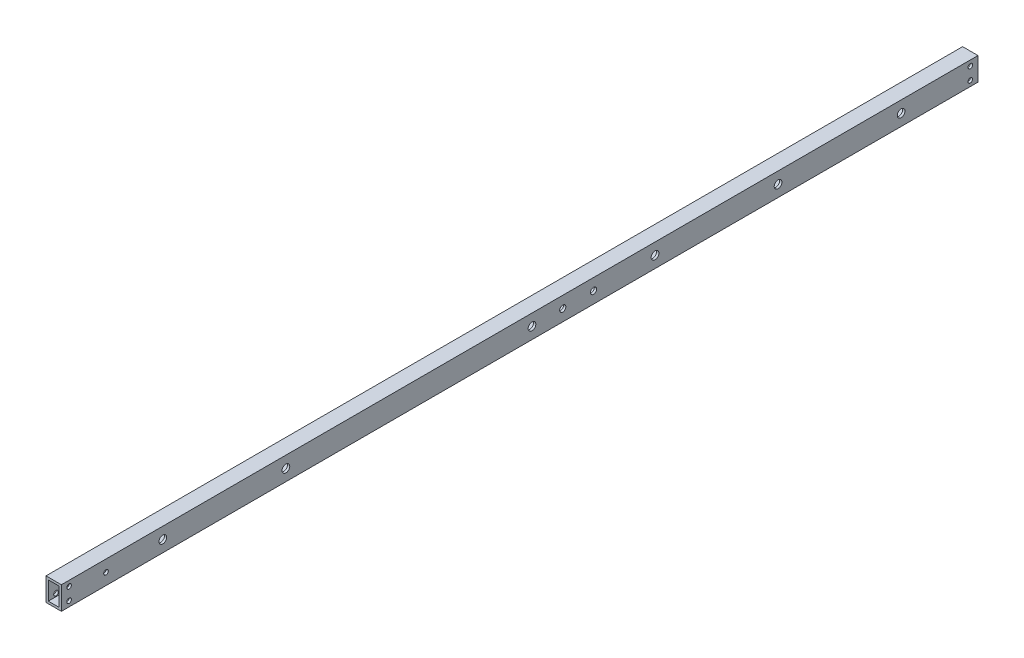
ISO-10303-21;
HEADER;
FILE_DESCRIPTION(('STEP AP214'),'2;1');
FILE_NAME('part.step','',(''),(''),'','','');
FILE_SCHEMA(('AUTOMOTIVE_DESIGN { 1 0 10303 214 1 1 1 1 }'));
ENDSEC;
DATA;
#1=APPLICATION_CONTEXT('core data for automotive mechanical design processes');
#2=APPLICATION_PROTOCOL_DEFINITION('international standard','automotive_design',2000,#1);
#3=PRODUCT_CONTEXT('',#1,'mechanical');
#4=PRODUCT('Part','Part','',(#3));
#5=PRODUCT_RELATED_PRODUCT_CATEGORY('part','',(#4));
#6=PRODUCT_DEFINITION_FORMATION('','',#4);
#7=PRODUCT_DEFINITION_CONTEXT('part definition',#1,'design');
#8=PRODUCT_DEFINITION('design','',#6,#7);
#9=PRODUCT_DEFINITION_SHAPE('','',#8);
#10=(LENGTH_UNIT() NAMED_UNIT(*) SI_UNIT(.MILLI.,.METRE.));
#11=(NAMED_UNIT(*) PLANE_ANGLE_UNIT() SI_UNIT($,.RADIAN.));
#12=(NAMED_UNIT(*) SI_UNIT($,.STERADIAN.) SOLID_ANGLE_UNIT());
#13=UNCERTAINTY_MEASURE_WITH_UNIT(LENGTH_MEASURE(1.E-05),#10,'distance_accuracy_value','');
#14=(GEOMETRIC_REPRESENTATION_CONTEXT(3) GLOBAL_UNCERTAINTY_ASSIGNED_CONTEXT((#13)) GLOBAL_UNIT_ASSIGNED_CONTEXT((#10,
#11,#12)) REPRESENTATION_CONTEXT('',''));
#15=CARTESIAN_POINT('',(0.,0.,0.));
#16=DIRECTION('',(0.,0.,1.));
#17=DIRECTION('',(1.,0.,0.));
#18=AXIS2_PLACEMENT_3D('',#15,#16,#17);
#19=CARTESIAN_POINT('',(0.,0.,596.));
#20=DIRECTION('',(0.,0.,1.));
#21=DIRECTION('',(1.,0.,0.));
#22=AXIS2_PLACEMENT_3D('',#19,#20,#21);
#23=PLANE('',#22);
#24=DIRECTION('',(0.,1.,0.));
#25=VECTOR('',#24,1.);
#26=CARTESIAN_POINT('',(5.,-7.5,596.));
#27=LINE('',#26,#25);
#28=CARTESIAN_POINT('',(5.,-7.5,596.));
#29=VERTEX_POINT('',#28);
#30=CARTESIAN_POINT('',(5.,7.5,596.));
#31=VERTEX_POINT('',#30);
#32=EDGE_CURVE('E181',#29,#31,#27,.T.);
#33=ORIENTED_EDGE('',*,*,#32,.T.);
#34=DIRECTION('',(-1.,0.,0.));
#35=VECTOR('',#34,1.);
#36=CARTESIAN_POINT('',(-5.,7.5,596.));
#37=LINE('',#36,#35);
#38=CARTESIAN_POINT('',(-5.,7.5,596.));
#39=VERTEX_POINT('',#38);
#40=EDGE_CURVE('E185',#31,#39,#37,.T.);
#41=ORIENTED_EDGE('',*,*,#40,.T.);
#42=DIRECTION('',(0.,-1.,0.));
#43=VECTOR('',#42,1.);
#44=CARTESIAN_POINT('',(-5.,-7.5,596.));
#45=LINE('',#44,#43);
#46=CARTESIAN_POINT('',(-5.,-7.5,596.));
#47=VERTEX_POINT('',#46);
#48=EDGE_CURVE('E189',#39,#47,#45,.T.);
#49=ORIENTED_EDGE('',*,*,#48,.T.);
#50=DIRECTION('',(1.,0.,0.));
#51=VECTOR('',#50,1.);
#52=CARTESIAN_POINT('',(-5.,-7.5,596.));
#53=LINE('',#52,#51);
#54=EDGE_CURVE('E192',#47,#29,#53,.T.);
#55=ORIENTED_EDGE('',*,*,#54,.T.);
#56=EDGE_LOOP('',(#33,#41,#49,#55));
#57=FACE_BOUND('',#56,.T.);
#58=DIRECTION('',(-1.,0.,0.));
#59=VECTOR('',#58,1.);
#60=CARTESIAN_POINT('',(0.,6.,596.));
#61=LINE('',#60,#59);
#62=CARTESIAN_POINT('',(3.5,6.,596.));
#63=VERTEX_POINT('',#62);
#64=CARTESIAN_POINT('',(-3.5,6.,596.));
#65=VERTEX_POINT('',#64);
#66=EDGE_CURVE('E140',#63,#65,#61,.T.);
#67=ORIENTED_EDGE('',*,*,#66,.F.);
#68=DIRECTION('',(0.,1.,0.));
#69=VECTOR('',#68,1.);
#70=CARTESIAN_POINT('',(3.5,0.,596.));
#71=LINE('',#70,#69);
#72=CARTESIAN_POINT('',(3.5,-6.,596.));
#73=VERTEX_POINT('',#72);
#74=EDGE_CURVE('E131',#73,#63,#71,.T.);
#75=ORIENTED_EDGE('',*,*,#74,.F.);
#76=DIRECTION('',(1.,0.,0.));
#77=VECTOR('',#76,1.);
#78=CARTESIAN_POINT('',(0.,-6.,596.));
#79=LINE('',#78,#77);
#80=CARTESIAN_POINT('',(-3.5,-6.,596.));
#81=VERTEX_POINT('',#80);
#82=EDGE_CURVE('E157',#81,#73,#79,.T.);
#83=ORIENTED_EDGE('',*,*,#82,.F.);
#84=DIRECTION('',(0.,-1.,0.));
#85=VECTOR('',#84,1.);
#86=CARTESIAN_POINT('',(-3.5,0.,596.));
#87=LINE('',#86,#85);
#88=EDGE_CURVE('E153',#65,#81,#87,.T.);
#89=ORIENTED_EDGE('',*,*,#88,.F.);
#90=EDGE_LOOP('',(#67,#75,#83,#89));
#91=FACE_BOUND('',#90,.T.);
#92=ADVANCED_FACE('F63',(#57,#91),#23,.T.);
#93=CARTESIAN_POINT('',(0.,0.,0.));
#94=DIRECTION('',(0.,0.,1.));
#95=DIRECTION('',(1.,0.,0.));
#96=AXIS2_PLACEMENT_3D('',#93,#94,#95);
#97=PLANE('',#96);
#98=DIRECTION('',(0.,1.,0.));
#99=VECTOR('',#98,1.);
#100=CARTESIAN_POINT('',(5.,-7.5,0.));
#101=LINE('',#100,#99);
#102=CARTESIAN_POINT('',(5.,-7.5,0.));
#103=VERTEX_POINT('',#102);
#104=CARTESIAN_POINT('',(5.,7.5,0.));
#105=VERTEX_POINT('',#104);
#106=EDGE_CURVE('E149',#103,#105,#101,.T.);
#107=ORIENTED_EDGE('',*,*,#106,.F.);
#108=DIRECTION('',(1.,0.,0.));
#109=VECTOR('',#108,1.);
#110=CARTESIAN_POINT('',(-5.,-7.5,0.));
#111=LINE('',#110,#109);
#112=CARTESIAN_POINT('',(-5.,-7.5,0.));
#113=VERTEX_POINT('',#112);
#114=EDGE_CURVE('E186',#113,#103,#111,.T.);
#115=ORIENTED_EDGE('',*,*,#114,.F.);
#116=DIRECTION('',(0.,-1.,0.));
#117=VECTOR('',#116,1.);
#118=CARTESIAN_POINT('',(-5.,-7.5,0.));
#119=LINE('',#118,#117);
#120=CARTESIAN_POINT('',(-5.,7.5,0.));
#121=VERTEX_POINT('',#120);
#122=EDGE_CURVE('E202',#121,#113,#119,.T.);
#123=ORIENTED_EDGE('',*,*,#122,.F.);
#124=DIRECTION('',(-1.,0.,0.));
#125=VECTOR('',#124,1.);
#126=CARTESIAN_POINT('',(-5.,7.5,0.));
#127=LINE('',#126,#125);
#128=EDGE_CURVE('E199',#105,#121,#127,.T.);
#129=ORIENTED_EDGE('',*,*,#128,.F.);
#130=EDGE_LOOP('',(#107,#115,#123,#129));
#131=FACE_BOUND('',#130,.T.);
#132=DIRECTION('',(0.,1.,0.));
#133=VECTOR('',#132,1.);
#134=CARTESIAN_POINT('',(3.5,0.,0.));
#135=LINE('',#134,#133);
#136=CARTESIAN_POINT('',(3.5,-6.,0.));
#137=VERTEX_POINT('',#136);
#138=CARTESIAN_POINT('',(3.5,6.,0.));
#139=VERTEX_POINT('',#138);
#140=EDGE_CURVE('E89',#137,#139,#135,.T.);
#141=ORIENTED_EDGE('',*,*,#140,.T.);
#142=DIRECTION('',(-1.,0.,0.));
#143=VECTOR('',#142,1.);
#144=CARTESIAN_POINT('',(0.,6.,0.));
#145=LINE('',#144,#143);
#146=CARTESIAN_POINT('',(-3.5,6.,0.));
#147=VERTEX_POINT('',#146);
#148=EDGE_CURVE('E147',#139,#147,#145,.T.);
#149=ORIENTED_EDGE('',*,*,#148,.T.);
#150=DIRECTION('',(0.,-1.,0.));
#151=VECTOR('',#150,1.);
#152=CARTESIAN_POINT('',(-3.5,0.,0.));
#153=LINE('',#152,#151);
#154=CARTESIAN_POINT('',(-3.5,-6.,0.));
#155=VERTEX_POINT('',#154);
#156=EDGE_CURVE('E168',#147,#155,#153,.T.);
#157=ORIENTED_EDGE('',*,*,#156,.T.);
#158=DIRECTION('',(1.,0.,0.));
#159=VECTOR('',#158,1.);
#160=CARTESIAN_POINT('',(0.,-6.,0.));
#161=LINE('',#160,#159);
#162=EDGE_CURVE('E141',#155,#137,#161,.T.);
#163=ORIENTED_EDGE('',*,*,#162,.T.);
#164=EDGE_LOOP('',(#141,#149,#157,#163));
#165=FACE_BOUND('',#164,.T.);
#166=ADVANCED_FACE('F508',(#131,#165),#97,.F.);
#167=CARTESIAN_POINT('',(5.,-7.5,596.));
#168=DIRECTION('',(-1.,0.,0.));
#169=DIRECTION('',(0.,0.,1.));
#170=AXIS2_PLACEMENT_3D('',#167,#168,#169);
#171=PLANE('',#170);
#172=CARTESIAN_POINT('',(5.,0.,270.));
#173=DIRECTION('',(1.,0.,0.));
#174=DIRECTION('',(0.,0.,1.));
#175=AXIS2_PLACEMENT_3D('',#172,#173,#174);
#176=CIRCLE('',#175,2.);
#177=CARTESIAN_POINT('',(5.,0.,272.));
#178=VERTEX_POINT('',#177);
#179=EDGE_CURVE('E398',#178,#178,#176,.T.);
#180=ORIENTED_EDGE('',*,*,#179,.F.);
#181=EDGE_LOOP('',(#180));
#182=FACE_BOUND('',#181,.T.);
#183=CARTESIAN_POINT('',(5.,0.,250.));
#184=DIRECTION('',(1.,0.,0.));
#185=DIRECTION('',(0.,0.,-1.));
#186=AXIS2_PLACEMENT_3D('',#183,#184,#185);
#187=CIRCLE('',#186,2.);
#188=CARTESIAN_POINT('',(5.,0.,248.));
#189=VERTEX_POINT('',#188);
#190=EDGE_CURVE('E402',#189,#189,#187,.T.);
#191=ORIENTED_EDGE('',*,*,#190,.F.);
#192=EDGE_LOOP('',(#191));
#193=FACE_BOUND('',#192,.T.);
#194=CARTESIAN_POINT('',(5.,0.,530.));
#195=DIRECTION('',(1.,0.,0.));
#196=DIRECTION('',(0.,0.,-1.));
#197=AXIS2_PLACEMENT_3D('',#194,#195,#196);
#198=CIRCLE('',#197,2.50000000000003);
#199=CARTESIAN_POINT('',(5.,0.,527.5));
#200=VERTEX_POINT('',#199);
#201=EDGE_CURVE('E407',#200,#200,#198,.T.);
#202=ORIENTED_EDGE('',*,*,#201,.F.);
#203=EDGE_LOOP('',(#202));
#204=FACE_BOUND('',#203,.T.);
#205=CARTESIAN_POINT('',(5.,0.,567.));
#206=DIRECTION('',(1.,0.,0.));
#207=DIRECTION('',(0.,0.,-1.));
#208=AXIS2_PLACEMENT_3D('',#205,#206,#207);
#209=CIRCLE('',#208,1.49999999999997);
#210=CARTESIAN_POINT('',(5.,0.,565.5));
#211=VERTEX_POINT('',#210);
#212=EDGE_CURVE('E415',#211,#211,#209,.T.);
#213=ORIENTED_EDGE('',*,*,#212,.F.);
#214=EDGE_LOOP('',(#213));
#215=FACE_BOUND('',#214,.T.);
#216=CARTESIAN_POINT('',(5.,0.,50.));
#217=DIRECTION('',(1.,0.,0.));
#218=DIRECTION('',(0.,0.,-1.));
#219=AXIS2_PLACEMENT_3D('',#216,#217,#218);
#220=CIRCLE('',#219,2.5);
#221=CARTESIAN_POINT('',(5.,0.,47.5));
#222=VERTEX_POINT('',#221);
#223=EDGE_CURVE('E377',#222,#222,#220,.T.);
#224=ORIENTED_EDGE('',*,*,#223,.F.);
#225=EDGE_LOOP('',(#224));
#226=FACE_BOUND('',#225,.T.);
#227=CARTESIAN_POINT('',(5.,-4.,591.));
#228=DIRECTION('',(1.,0.,0.));
#229=DIRECTION('',(0.,0.,1.));
#230=AXIS2_PLACEMENT_3D('',#227,#228,#229);
#231=CIRCLE('',#230,1.49999999999997);
#232=CARTESIAN_POINT('',(5.,-4.,592.5));
#233=VERTEX_POINT('',#232);
#234=EDGE_CURVE('E366',#233,#233,#231,.T.);
#235=ORIENTED_EDGE('',*,*,#234,.F.);
#236=EDGE_LOOP('',(#235));
#237=FACE_BOUND('',#236,.T.);
#238=CARTESIAN_POINT('',(5.,-4.,5.));
#239=DIRECTION('',(1.,0.,0.));
#240=DIRECTION('',(0.,0.,1.));
#241=AXIS2_PLACEMENT_3D('',#238,#239,#240);
#242=CIRCLE('',#241,1.5);
#243=CARTESIAN_POINT('',(5.,-4.,6.5));
#244=VERTEX_POINT('',#243);
#245=EDGE_CURVE('E354',#244,#244,#242,.T.);
#246=ORIENTED_EDGE('',*,*,#245,.F.);
#247=EDGE_LOOP('',(#246));
#248=FACE_BOUND('',#247,.T.);
#249=CARTESIAN_POINT('',(5.,4.,5.));
#250=DIRECTION('',(1.,0.,0.));
#251=DIRECTION('',(0.,0.,-1.));
#252=AXIS2_PLACEMENT_3D('',#249,#250,#251);
#253=CIRCLE('',#252,1.5);
#254=CARTESIAN_POINT('',(5.,4.,3.5));
#255=VERTEX_POINT('',#254);
#256=EDGE_CURVE('E363',#255,#255,#253,.T.);
#257=ORIENTED_EDGE('',*,*,#256,.F.);
#258=EDGE_LOOP('',(#257));
#259=FACE_BOUND('',#258,.T.);
#260=CARTESIAN_POINT('',(5.,0.,130.));
#261=DIRECTION('',(1.,0.,0.));
#262=DIRECTION('',(0.,0.,-1.));
#263=AXIS2_PLACEMENT_3D('',#260,#261,#262);
#264=CIRCLE('',#263,2.5);
#265=CARTESIAN_POINT('',(5.,0.,127.5));
#266=VERTEX_POINT('',#265);
#267=EDGE_CURVE('E438',#266,#266,#264,.T.);
#268=ORIENTED_EDGE('',*,*,#267,.F.);
#269=EDGE_LOOP('',(#268));
#270=FACE_BOUND('',#269,.T.);
#271=CARTESIAN_POINT('',(5.,0.,290.));
#272=DIRECTION('',(1.,0.,0.));
#273=DIRECTION('',(0.,0.,-1.));
#274=AXIS2_PLACEMENT_3D('',#271,#272,#273);
#275=CIRCLE('',#274,2.50000000000002);
#276=CARTESIAN_POINT('',(5.,0.,287.5));
#277=VERTEX_POINT('',#276);
#278=EDGE_CURVE('E447',#277,#277,#275,.T.);
#279=ORIENTED_EDGE('',*,*,#278,.F.);
#280=EDGE_LOOP('',(#279));
#281=FACE_BOUND('',#280,.T.);
#282=CARTESIAN_POINT('',(5.,0.,210.));
#283=DIRECTION('',(1.,0.,0.));
#284=DIRECTION('',(0.,0.,-1.));
#285=AXIS2_PLACEMENT_3D('',#282,#283,#284);
#286=CIRCLE('',#285,2.50000000000002);
#287=CARTESIAN_POINT('',(5.,0.,207.5));
#288=VERTEX_POINT('',#287);
#289=EDGE_CURVE('E422',#288,#288,#286,.T.);
#290=ORIENTED_EDGE('',*,*,#289,.F.);
#291=EDGE_LOOP('',(#290));
#292=FACE_BOUND('',#291,.T.);
#293=CARTESIAN_POINT('',(5.,0.,450.));
#294=DIRECTION('',(1.,0.,0.));
#295=DIRECTION('',(0.,0.,-1.));
#296=AXIS2_PLACEMENT_3D('',#293,#294,#295);
#297=CIRCLE('',#296,2.50000000000002);
#298=CARTESIAN_POINT('',(5.,0.,447.5));
#299=VERTEX_POINT('',#298);
#300=EDGE_CURVE('E431',#299,#299,#297,.T.);
#301=ORIENTED_EDGE('',*,*,#300,.F.);
#302=EDGE_LOOP('',(#301));
#303=FACE_BOUND('',#302,.T.);
#304=CARTESIAN_POINT('',(5.,4.,591.));
#305=DIRECTION('',(1.,0.,0.));
#306=DIRECTION('',(0.,0.,-1.));
#307=AXIS2_PLACEMENT_3D('',#304,#305,#306);
#308=CIRCLE('',#307,1.49999999999997);
#309=CARTESIAN_POINT('',(5.,4.,589.5));
#310=VERTEX_POINT('',#309);
#311=EDGE_CURVE('E332',#310,#310,#308,.T.);
#312=ORIENTED_EDGE('',*,*,#311,.F.);
#313=EDGE_LOOP('',(#312));
#314=FACE_BOUND('',#313,.T.);
#315=ORIENTED_EDGE('',*,*,#106,.T.);
#316=DIRECTION('',(0.,0.,-1.));
#317=VECTOR('',#316,1.);
#318=CARTESIAN_POINT('',(5.,7.5,596.));
#319=LINE('',#318,#317);
#320=EDGE_CURVE('E12',#31,#105,#319,.T.);
#321=ORIENTED_EDGE('',*,*,#320,.F.);
#322=ORIENTED_EDGE('',*,*,#32,.F.);
#323=DIRECTION('',(0.,0.,-1.));
#324=VECTOR('',#323,1.);
#325=CARTESIAN_POINT('',(5.,-7.5,596.));
#326=LINE('',#325,#324);
#327=EDGE_CURVE('E195',#29,#103,#326,.T.);
#328=ORIENTED_EDGE('',*,*,#327,.T.);
#329=EDGE_LOOP('',(#315,#321,#322,#328));
#330=FACE_BOUND('',#329,.T.);
#331=ADVANCED_FACE('F65',(#182,#193,#204,#215,#226,#237,#248,#259,#270,#281,#292,#303,#314,
#330),#171,.F.);
#332=CARTESIAN_POINT('',(-5.,7.5,596.));
#333=DIRECTION('',(0.,-1.,0.));
#334=DIRECTION('',(0.,0.,-1.));
#335=AXIS2_PLACEMENT_3D('',#332,#333,#334);
#336=PLANE('',#335);
#337=ORIENTED_EDGE('',*,*,#128,.T.);
#338=DIRECTION('',(0.,0.,-1.));
#339=VECTOR('',#338,1.);
#340=CARTESIAN_POINT('',(-5.,7.5,596.));
#341=LINE('',#340,#339);
#342=EDGE_CURVE('E73',#39,#121,#341,.T.);
#343=ORIENTED_EDGE('',*,*,#342,.F.);
#344=ORIENTED_EDGE('',*,*,#40,.F.);
#345=ORIENTED_EDGE('',*,*,#320,.T.);
#346=EDGE_LOOP('',(#337,#343,#344,#345));
#347=FACE_BOUND('',#346,.T.);
#348=ADVANCED_FACE('F476',(#347),#336,.F.);
#349=CARTESIAN_POINT('',(-5.,-7.5,596.));
#350=DIRECTION('',(1.,0.,0.));
#351=DIRECTION('',(0.,0.,-1.));
#352=AXIS2_PLACEMENT_3D('',#349,#350,#351);
#353=PLANE('',#352);
#354=CARTESIAN_POINT('',(-5.,0.,250.));
#355=DIRECTION('',(-1.,0.,0.));
#356=DIRECTION('',(0.,0.,1.));
#357=AXIS2_PLACEMENT_3D('',#354,#355,#356);
#358=CIRCLE('',#357,3.99999999999999);
#359=CARTESIAN_POINT('',(-5.,0.,254.));
#360=VERTEX_POINT('',#359);
#361=EDGE_CURVE('E458',#360,#360,#358,.T.);
#362=ORIENTED_EDGE('',*,*,#361,.F.);
#363=EDGE_LOOP('',(#362));
#364=FACE_BOUND('',#363,.T.);
#365=CARTESIAN_POINT('',(-5.,0.,270.));
#366=DIRECTION('',(-1.,0.,0.));
#367=DIRECTION('',(0.,0.,1.));
#368=AXIS2_PLACEMENT_3D('',#365,#366,#367);
#369=CIRCLE('',#368,3.99999999999999);
#370=CARTESIAN_POINT('',(-5.,0.,274.));
#371=VERTEX_POINT('',#370);
#372=EDGE_CURVE('E459',#371,#371,#369,.T.);
#373=ORIENTED_EDGE('',*,*,#372,.F.);
#374=EDGE_LOOP('',(#373));
#375=FACE_BOUND('',#374,.T.);
#376=CARTESIAN_POINT('',(-5.,0.,530.));
#377=DIRECTION('',(1.,0.,0.));
#378=DIRECTION('',(0.,0.,-1.));
#379=AXIS2_PLACEMENT_3D('',#376,#377,#378);
#380=CIRCLE('',#379,2.50000000000003);
#381=CARTESIAN_POINT('',(-5.,0.,527.5));
#382=VERTEX_POINT('',#381);
#383=EDGE_CURVE('E411',#382,#382,#380,.T.);
#384=ORIENTED_EDGE('',*,*,#383,.T.);
#385=EDGE_LOOP('',(#384));
#386=FACE_BOUND('',#385,.T.);
#387=CARTESIAN_POINT('',(-5.,0.,567.));
#388=DIRECTION('',(1.,0.,0.));
#389=DIRECTION('',(0.,0.,-1.));
#390=AXIS2_PLACEMENT_3D('',#387,#388,#389);
#391=CIRCLE('',#390,1.49999999999997);
#392=CARTESIAN_POINT('',(-5.,0.,565.5));
#393=VERTEX_POINT('',#392);
#394=EDGE_CURVE('E380',#393,#393,#391,.T.);
#395=ORIENTED_EDGE('',*,*,#394,.T.);
#396=EDGE_LOOP('',(#395));
#397=FACE_BOUND('',#396,.T.);
#398=CARTESIAN_POINT('',(-5.,0.,50.));
#399=DIRECTION('',(1.,0.,0.));
#400=DIRECTION('',(0.,0.,-1.));
#401=AXIS2_PLACEMENT_3D('',#398,#399,#400);
#402=CIRCLE('',#401,2.5);
#403=CARTESIAN_POINT('',(-5.,0.,47.5));
#404=VERTEX_POINT('',#403);
#405=EDGE_CURVE('E373',#404,#404,#402,.T.);
#406=ORIENTED_EDGE('',*,*,#405,.T.);
#407=EDGE_LOOP('',(#406));
#408=FACE_BOUND('',#407,.T.);
#409=CARTESIAN_POINT('',(-5.,-4.,591.));
#410=DIRECTION('',(1.,0.,0.));
#411=DIRECTION('',(0.,0.,1.));
#412=AXIS2_PLACEMENT_3D('',#409,#410,#411);
#413=CIRCLE('',#412,1.49999999999997);
#414=CARTESIAN_POINT('',(-5.,-4.,592.5));
#415=VERTEX_POINT('',#414);
#416=EDGE_CURVE('E358',#415,#415,#413,.T.);
#417=ORIENTED_EDGE('',*,*,#416,.T.);
#418=EDGE_LOOP('',(#417));
#419=FACE_BOUND('',#418,.T.);
#420=CARTESIAN_POINT('',(-5.,-4.,5.));
#421=DIRECTION('',(1.,0.,0.));
#422=DIRECTION('',(0.,0.,1.));
#423=AXIS2_PLACEMENT_3D('',#420,#421,#422);
#424=CIRCLE('',#423,1.5);
#425=CARTESIAN_POINT('',(-5.,-4.,6.5));
#426=VERTEX_POINT('',#425);
#427=EDGE_CURVE('E357',#426,#426,#424,.T.);
#428=ORIENTED_EDGE('',*,*,#427,.T.);
#429=EDGE_LOOP('',(#428));
#430=FACE_BOUND('',#429,.T.);
#431=CARTESIAN_POINT('',(-5.,4.,5.));
#432=DIRECTION('',(1.,0.,0.));
#433=DIRECTION('',(0.,0.,-1.));
#434=AXIS2_PLACEMENT_3D('',#431,#432,#433);
#435=CIRCLE('',#434,1.5);
#436=CARTESIAN_POINT('',(-5.,4.,3.5));
#437=VERTEX_POINT('',#436);
#438=EDGE_CURVE('E387',#437,#437,#435,.T.);
#439=ORIENTED_EDGE('',*,*,#438,.T.);
#440=EDGE_LOOP('',(#439));
#441=FACE_BOUND('',#440,.T.);
#442=CARTESIAN_POINT('',(-5.,0.,130.));
#443=DIRECTION('',(1.,0.,0.));
#444=DIRECTION('',(0.,0.,-1.));
#445=AXIS2_PLACEMENT_3D('',#442,#443,#444);
#446=CIRCLE('',#445,2.5);
#447=CARTESIAN_POINT('',(-5.,0.,127.5));
#448=VERTEX_POINT('',#447);
#449=EDGE_CURVE('E442',#448,#448,#446,.T.);
#450=ORIENTED_EDGE('',*,*,#449,.T.);
#451=EDGE_LOOP('',(#450));
#452=FACE_BOUND('',#451,.T.);
#453=CARTESIAN_POINT('',(-5.,0.,290.));
#454=DIRECTION('',(1.,0.,0.));
#455=DIRECTION('',(0.,0.,-1.));
#456=AXIS2_PLACEMENT_3D('',#453,#454,#455);
#457=CIRCLE('',#456,2.50000000000002);
#458=CARTESIAN_POINT('',(-5.,0.,287.5));
#459=VERTEX_POINT('',#458);
#460=EDGE_CURVE('E427',#459,#459,#457,.T.);
#461=ORIENTED_EDGE('',*,*,#460,.T.);
#462=EDGE_LOOP('',(#461));
#463=FACE_BOUND('',#462,.T.);
#464=CARTESIAN_POINT('',(-5.,0.,210.));
#465=DIRECTION('',(1.,0.,0.));
#466=DIRECTION('',(0.,0.,-1.));
#467=AXIS2_PLACEMENT_3D('',#464,#465,#466);
#468=CIRCLE('',#467,2.50000000000002);
#469=CARTESIAN_POINT('',(-5.,0.,207.5));
#470=VERTEX_POINT('',#469);
#471=EDGE_CURVE('E426',#470,#470,#468,.T.);
#472=ORIENTED_EDGE('',*,*,#471,.T.);
#473=EDGE_LOOP('',(#472));
#474=FACE_BOUND('',#473,.T.);
#475=CARTESIAN_POINT('',(-5.,0.,450.));
#476=DIRECTION('',(1.,0.,0.));
#477=DIRECTION('',(0.,0.,-1.));
#478=AXIS2_PLACEMENT_3D('',#475,#476,#477);
#479=CIRCLE('',#478,2.50000000000002);
#480=CARTESIAN_POINT('',(-5.,0.,447.5));
#481=VERTEX_POINT('',#480);
#482=EDGE_CURVE('E403',#481,#481,#479,.T.);
#483=ORIENTED_EDGE('',*,*,#482,.T.);
#484=EDGE_LOOP('',(#483));
#485=FACE_BOUND('',#484,.T.);
#486=CARTESIAN_POINT('',(-5.,4.,591.));
#487=DIRECTION('',(1.,0.,0.));
#488=DIRECTION('',(0.,0.,-1.));
#489=AXIS2_PLACEMENT_3D('',#486,#487,#488);
#490=CIRCLE('',#489,1.49999999999997);
#491=CARTESIAN_POINT('',(-5.,4.,589.5));
#492=VERTEX_POINT('',#491);
#493=EDGE_CURVE('E222',#492,#492,#490,.T.);
#494=ORIENTED_EDGE('',*,*,#493,.T.);
#495=EDGE_LOOP('',(#494));
#496=FACE_BOUND('',#495,.T.);
#497=ORIENTED_EDGE('',*,*,#122,.T.);
#498=DIRECTION('',(0.,0.,-1.));
#499=VECTOR('',#498,1.);
#500=CARTESIAN_POINT('',(-5.,-7.5,596.));
#501=LINE('',#500,#499);
#502=EDGE_CURVE('E210',#47,#113,#501,.T.);
#503=ORIENTED_EDGE('',*,*,#502,.F.);
#504=ORIENTED_EDGE('',*,*,#48,.F.);
#505=ORIENTED_EDGE('',*,*,#342,.T.);
#506=EDGE_LOOP('',(#497,#503,#504,#505));
#507=FACE_BOUND('',#506,.T.);
#508=ADVANCED_FACE('F473',(#364,#375,#386,#397,#408,#419,#430,#441,#452,#463,#474,#485,#496,
#507),#353,.F.);
#509=CARTESIAN_POINT('',(-5.,-7.5,596.));
#510=DIRECTION('',(0.,1.,0.));
#511=DIRECTION('',(0.,0.,1.));
#512=AXIS2_PLACEMENT_3D('',#509,#510,#511);
#513=PLANE('',#512);
#514=ORIENTED_EDGE('',*,*,#114,.T.);
#515=ORIENTED_EDGE('',*,*,#327,.F.);
#516=ORIENTED_EDGE('',*,*,#54,.F.);
#517=ORIENTED_EDGE('',*,*,#502,.T.);
#518=EDGE_LOOP('',(#514,#515,#516,#517));
#519=FACE_BOUND('',#518,.T.);
#520=ADVANCED_FACE('F295',(#519),#513,.F.);
#521=CARTESIAN_POINT('',(3.5,0.,596.));
#522=DIRECTION('',(-1.,0.,0.));
#523=DIRECTION('',(0.,0.,1.));
#524=AXIS2_PLACEMENT_3D('',#521,#522,#523);
#525=PLANE('',#524);
#526=CARTESIAN_POINT('',(3.5,0.,270.));
#527=DIRECTION('',(-1.,0.,0.));
#528=DIRECTION('',(0.,0.,1.));
#529=AXIS2_PLACEMENT_3D('',#526,#527,#528);
#530=CIRCLE('',#529,2.);
#531=CARTESIAN_POINT('',(3.5,0.,272.));
#532=VERTEX_POINT('',#531);
#533=EDGE_CURVE('E165',#532,#532,#530,.T.);
#534=ORIENTED_EDGE('',*,*,#533,.F.);
#535=EDGE_LOOP('',(#534));
#536=FACE_BOUND('',#535,.T.);
#537=CARTESIAN_POINT('',(3.5,0.,250.));
#538=DIRECTION('',(-1.,0.,0.));
#539=DIRECTION('',(0.,0.,1.));
#540=AXIS2_PLACEMENT_3D('',#537,#538,#539);
#541=CIRCLE('',#540,2.);
#542=CARTESIAN_POINT('',(3.5,0.,252.));
#543=VERTEX_POINT('',#542);
#544=EDGE_CURVE('E283',#543,#543,#541,.T.);
#545=ORIENTED_EDGE('',*,*,#544,.F.);
#546=EDGE_LOOP('',(#545));
#547=FACE_BOUND('',#546,.T.);
#548=CARTESIAN_POINT('',(3.5,0.,530.));
#549=DIRECTION('',(-1.,0.,0.));
#550=DIRECTION('',(0.,0.,1.));
#551=AXIS2_PLACEMENT_3D('',#548,#549,#550);
#552=CIRCLE('',#551,2.50000000000003);
#553=CARTESIAN_POINT('',(3.5,0.,532.5));
#554=VERTEX_POINT('',#553);
#555=EDGE_CURVE('E279',#554,#554,#552,.T.);
#556=ORIENTED_EDGE('',*,*,#555,.F.);
#557=EDGE_LOOP('',(#556));
#558=FACE_BOUND('',#557,.T.);
#559=CARTESIAN_POINT('',(3.5,0.,567.));
#560=DIRECTION('',(-1.,0.,0.));
#561=DIRECTION('',(0.,0.,1.));
#562=AXIS2_PLACEMENT_3D('',#559,#560,#561);
#563=CIRCLE('',#562,1.49999999999997);
#564=CARTESIAN_POINT('',(3.5,0.,568.5));
#565=VERTEX_POINT('',#564);
#566=EDGE_CURVE('E265',#565,#565,#563,.T.);
#567=ORIENTED_EDGE('',*,*,#566,.F.);
#568=EDGE_LOOP('',(#567));
#569=FACE_BOUND('',#568,.T.);
#570=CARTESIAN_POINT('',(3.5,0.,50.));
#571=DIRECTION('',(-1.,0.,0.));
#572=DIRECTION('',(0.,0.,1.));
#573=AXIS2_PLACEMENT_3D('',#570,#571,#572);
#574=CIRCLE('',#573,2.5);
#575=CARTESIAN_POINT('',(3.5,0.,52.5));
#576=VERTEX_POINT('',#575);
#577=EDGE_CURVE('E261',#576,#576,#574,.T.);
#578=ORIENTED_EDGE('',*,*,#577,.F.);
#579=EDGE_LOOP('',(#578));
#580=FACE_BOUND('',#579,.T.);
#581=CARTESIAN_POINT('',(3.5,-4.,591.));
#582=DIRECTION('',(-1.,0.,0.));
#583=DIRECTION('',(0.,0.,1.));
#584=AXIS2_PLACEMENT_3D('',#581,#582,#583);
#585=CIRCLE('',#584,1.49999999999997);
#586=CARTESIAN_POINT('',(3.5,-4.,592.5));
#587=VERTEX_POINT('',#586);
#588=EDGE_CURVE('E257',#587,#587,#585,.T.);
#589=ORIENTED_EDGE('',*,*,#588,.F.);
#590=EDGE_LOOP('',(#589));
#591=FACE_BOUND('',#590,.T.);
#592=CARTESIAN_POINT('',(3.5,-4.,5.));
#593=DIRECTION('',(-1.,0.,0.));
#594=DIRECTION('',(0.,0.,1.));
#595=AXIS2_PLACEMENT_3D('',#592,#593,#594);
#596=CIRCLE('',#595,1.5);
#597=CARTESIAN_POINT('',(3.5,-4.,6.5));
#598=VERTEX_POINT('',#597);
#599=EDGE_CURVE('E252',#598,#598,#596,.T.);
#600=ORIENTED_EDGE('',*,*,#599,.F.);
#601=EDGE_LOOP('',(#600));
#602=FACE_BOUND('',#601,.T.);
#603=CARTESIAN_POINT('',(3.5,4.,5.));
#604=DIRECTION('',(-1.,0.,0.));
#605=DIRECTION('',(0.,0.,1.));
#606=AXIS2_PLACEMENT_3D('',#603,#604,#605);
#607=CIRCLE('',#606,1.5);
#608=CARTESIAN_POINT('',(3.5,4.,6.50000000000001));
#609=VERTEX_POINT('',#608);
#610=EDGE_CURVE('E247',#609,#609,#607,.T.);
#611=ORIENTED_EDGE('',*,*,#610,.F.);
#612=EDGE_LOOP('',(#611));
#613=FACE_BOUND('',#612,.T.);
#614=CARTESIAN_POINT('',(3.5,0.,130.));
#615=DIRECTION('',(-1.,0.,0.));
#616=DIRECTION('',(0.,0.,1.));
#617=AXIS2_PLACEMENT_3D('',#614,#615,#616);
#618=CIRCLE('',#617,2.5);
#619=CARTESIAN_POINT('',(3.5,0.,132.5));
#620=VERTEX_POINT('',#619);
#621=EDGE_CURVE('E242',#620,#620,#618,.T.);
#622=ORIENTED_EDGE('',*,*,#621,.F.);
#623=EDGE_LOOP('',(#622));
#624=FACE_BOUND('',#623,.T.);
#625=CARTESIAN_POINT('',(3.5,0.,290.));
#626=DIRECTION('',(-1.,0.,0.));
#627=DIRECTION('',(0.,0.,1.));
#628=AXIS2_PLACEMENT_3D('',#625,#626,#627);
#629=CIRCLE('',#628,2.50000000000002);
#630=CARTESIAN_POINT('',(3.5,0.,292.5));
#631=VERTEX_POINT('',#630);
#632=EDGE_CURVE('E237',#631,#631,#629,.T.);
#633=ORIENTED_EDGE('',*,*,#632,.F.);
#634=EDGE_LOOP('',(#633));
#635=FACE_BOUND('',#634,.T.);
#636=CARTESIAN_POINT('',(3.5,0.,210.));
#637=DIRECTION('',(-1.,0.,0.));
#638=DIRECTION('',(0.,0.,1.));
#639=AXIS2_PLACEMENT_3D('',#636,#637,#638);
#640=CIRCLE('',#639,2.50000000000002);
#641=CARTESIAN_POINT('',(3.5,0.,212.5));
#642=VERTEX_POINT('',#641);
#643=EDGE_CURVE('E232',#642,#642,#640,.T.);
#644=ORIENTED_EDGE('',*,*,#643,.F.);
#645=EDGE_LOOP('',(#644));
#646=FACE_BOUND('',#645,.T.);
#647=CARTESIAN_POINT('',(3.5,0.,450.));
#648=DIRECTION('',(-1.,0.,0.));
#649=DIRECTION('',(0.,0.,1.));
#650=AXIS2_PLACEMENT_3D('',#647,#648,#649);
#651=CIRCLE('',#650,2.50000000000002);
#652=CARTESIAN_POINT('',(3.5,0.,452.5));
#653=VERTEX_POINT('',#652);
#654=EDGE_CURVE('E227',#653,#653,#651,.T.);
#655=ORIENTED_EDGE('',*,*,#654,.F.);
#656=EDGE_LOOP('',(#655));
#657=FACE_BOUND('',#656,.T.);
#658=CARTESIAN_POINT('',(3.5,4.,591.));
#659=DIRECTION('',(-1.,0.,0.));
#660=DIRECTION('',(0.,0.,1.));
#661=AXIS2_PLACEMENT_3D('',#658,#659,#660);
#662=CIRCLE('',#661,1.49999999999997);
#663=CARTESIAN_POINT('',(3.5,4.,592.5));
#664=VERTEX_POINT('',#663);
#665=EDGE_CURVE('E221',#664,#664,#662,.T.);
#666=ORIENTED_EDGE('',*,*,#665,.F.);
#667=EDGE_LOOP('',(#666));
#668=FACE_BOUND('',#667,.T.);
#669=ORIENTED_EDGE('',*,*,#140,.F.);
#670=DIRECTION('',(0.,0.,-1.));
#671=VECTOR('',#670,1.);
#672=CARTESIAN_POINT('',(3.5,-6.,596.));
#673=LINE('',#672,#671);
#674=EDGE_CURVE('E135',#73,#137,#673,.T.);
#675=ORIENTED_EDGE('',*,*,#674,.F.);
#676=ORIENTED_EDGE('',*,*,#74,.T.);
#677=DIRECTION('',(0.,0.,-1.));
#678=VECTOR('',#677,1.);
#679=CARTESIAN_POINT('',(3.5,6.,596.));
#680=LINE('',#679,#678);
#681=EDGE_CURVE('E134',#63,#139,#680,.T.);
#682=ORIENTED_EDGE('',*,*,#681,.T.);
#683=EDGE_LOOP('',(#669,#675,#676,#682));
#684=FACE_BOUND('',#683,.T.);
#685=ADVANCED_FACE('F133',(#536,#547,#558,#569,#580,#591,#602,#613,#624,#635,#646,#657,#668,
#684),#525,.T.);
#686=CARTESIAN_POINT('',(0.,6.,596.));
#687=DIRECTION('',(0.,-1.,0.));
#688=DIRECTION('',(0.,0.,-1.));
#689=AXIS2_PLACEMENT_3D('',#686,#687,#688);
#690=PLANE('',#689);
#691=ORIENTED_EDGE('',*,*,#148,.F.);
#692=ORIENTED_EDGE('',*,*,#681,.F.);
#693=ORIENTED_EDGE('',*,*,#66,.T.);
#694=DIRECTION('',(0.,0.,-1.));
#695=VECTOR('',#694,1.);
#696=CARTESIAN_POINT('',(-3.5,6.,596.));
#697=LINE('',#696,#695);
#698=EDGE_CURVE('E150',#65,#147,#697,.T.);
#699=ORIENTED_EDGE('',*,*,#698,.T.);
#700=EDGE_LOOP('',(#691,#692,#693,#699));
#701=FACE_BOUND('',#700,.T.);
#702=ADVANCED_FACE('F144',(#701),#690,.T.);
#703=CARTESIAN_POINT('',(-3.5,0.,596.));
#704=DIRECTION('',(1.,0.,0.));
#705=DIRECTION('',(0.,0.,-1.));
#706=AXIS2_PLACEMENT_3D('',#703,#704,#705);
#707=PLANE('',#706);
#708=CARTESIAN_POINT('',(-3.5,0.,250.));
#709=DIRECTION('',(1.,0.,0.));
#710=DIRECTION('',(0.,0.,-1.));
#711=AXIS2_PLACEMENT_3D('',#708,#709,#710);
#712=CIRCLE('',#711,3.99999999999999);
#713=CARTESIAN_POINT('',(-3.5,0.,246.));
#714=VERTEX_POINT('',#713);
#715=EDGE_CURVE('E443',#714,#714,#712,.F.);
#716=ORIENTED_EDGE('',*,*,#715,.T.);
#717=EDGE_LOOP('',(#716));
#718=FACE_BOUND('',#717,.T.);
#719=CARTESIAN_POINT('',(-3.5,0.,270.));
#720=DIRECTION('',(1.,0.,0.));
#721=DIRECTION('',(0.,0.,-1.));
#722=AXIS2_PLACEMENT_3D('',#719,#720,#721);
#723=CIRCLE('',#722,3.99999999999999);
#724=CARTESIAN_POINT('',(-3.5,0.,266.));
#725=VERTEX_POINT('',#724);
#726=EDGE_CURVE('E454',#725,#725,#723,.F.);
#727=ORIENTED_EDGE('',*,*,#726,.T.);
#728=EDGE_LOOP('',(#727));
#729=FACE_BOUND('',#728,.T.);
#730=CARTESIAN_POINT('',(-3.5,0.,530.));
#731=DIRECTION('',(1.,0.,0.));
#732=DIRECTION('',(0.,0.,-1.));
#733=AXIS2_PLACEMENT_3D('',#730,#731,#732);
#734=CIRCLE('',#733,2.50000000000003);
#735=CARTESIAN_POINT('',(-3.5,0.,527.5));
#736=VERTEX_POINT('',#735);
#737=EDGE_CURVE('E67',#736,#736,#734,.T.);
#738=ORIENTED_EDGE('',*,*,#737,.F.);
#739=EDGE_LOOP('',(#738));
#740=FACE_BOUND('',#739,.T.);
#741=CARTESIAN_POINT('',(-3.5,0.,567.));
#742=DIRECTION('',(1.,0.,0.));
#743=DIRECTION('',(0.,0.,-1.));
#744=AXIS2_PLACEMENT_3D('',#741,#742,#743);
#745=CIRCLE('',#744,1.49999999999997);
#746=CARTESIAN_POINT('',(-3.5,0.,565.5));
#747=VERTEX_POINT('',#746);
#748=EDGE_CURVE('E262',#747,#747,#745,.T.);
#749=ORIENTED_EDGE('',*,*,#748,.F.);
#750=EDGE_LOOP('',(#749));
#751=FACE_BOUND('',#750,.T.);
#752=CARTESIAN_POINT('',(-3.5,0.,50.));
#753=DIRECTION('',(1.,0.,0.));
#754=DIRECTION('',(0.,0.,-1.));
#755=AXIS2_PLACEMENT_3D('',#752,#753,#754);
#756=CIRCLE('',#755,2.5);
#757=CARTESIAN_POINT('',(-3.5,0.,47.5));
#758=VERTEX_POINT('',#757);
#759=EDGE_CURVE('E258',#758,#758,#756,.T.);
#760=ORIENTED_EDGE('',*,*,#759,.F.);
#761=EDGE_LOOP('',(#760));
#762=FACE_BOUND('',#761,.T.);
#763=CARTESIAN_POINT('',(-3.5,-4.,591.));
#764=DIRECTION('',(1.,0.,0.));
#765=DIRECTION('',(0.,0.,-1.));
#766=AXIS2_PLACEMENT_3D('',#763,#764,#765);
#767=CIRCLE('',#766,1.49999999999997);
#768=CARTESIAN_POINT('',(-3.5,-4.,589.5));
#769=VERTEX_POINT('',#768);
#770=EDGE_CURVE('E253',#769,#769,#767,.T.);
#771=ORIENTED_EDGE('',*,*,#770,.F.);
#772=EDGE_LOOP('',(#771));
#773=FACE_BOUND('',#772,.T.);
#774=CARTESIAN_POINT('',(-3.5,-4.,5.));
#775=DIRECTION('',(1.,0.,0.));
#776=DIRECTION('',(0.,0.,-1.));
#777=AXIS2_PLACEMENT_3D('',#774,#775,#776);
#778=CIRCLE('',#777,1.5);
#779=CARTESIAN_POINT('',(-3.5,-4.,3.5));
#780=VERTEX_POINT('',#779);
#781=EDGE_CURVE('E248',#780,#780,#778,.T.);
#782=ORIENTED_EDGE('',*,*,#781,.F.);
#783=EDGE_LOOP('',(#782));
#784=FACE_BOUND('',#783,.T.);
#785=CARTESIAN_POINT('',(-3.5,4.,5.));
#786=DIRECTION('',(1.,0.,0.));
#787=DIRECTION('',(0.,0.,-1.));
#788=AXIS2_PLACEMENT_3D('',#785,#786,#787);
#789=CIRCLE('',#788,1.5);
#790=CARTESIAN_POINT('',(-3.5,4.,3.5));
#791=VERTEX_POINT('',#790);
#792=EDGE_CURVE('E243',#791,#791,#789,.T.);
#793=ORIENTED_EDGE('',*,*,#792,.F.);
#794=EDGE_LOOP('',(#793));
#795=FACE_BOUND('',#794,.T.);
#796=CARTESIAN_POINT('',(-3.5,0.,130.));
#797=DIRECTION('',(1.,0.,0.));
#798=DIRECTION('',(0.,0.,-1.));
#799=AXIS2_PLACEMENT_3D('',#796,#797,#798);
#800=CIRCLE('',#799,2.5);
#801=CARTESIAN_POINT('',(-3.5,0.,127.5));
#802=VERTEX_POINT('',#801);
#803=EDGE_CURVE('E238',#802,#802,#800,.T.);
#804=ORIENTED_EDGE('',*,*,#803,.F.);
#805=EDGE_LOOP('',(#804));
#806=FACE_BOUND('',#805,.T.);
#807=CARTESIAN_POINT('',(-3.5,0.,290.));
#808=DIRECTION('',(1.,0.,0.));
#809=DIRECTION('',(0.,0.,-1.));
#810=AXIS2_PLACEMENT_3D('',#807,#808,#809);
#811=CIRCLE('',#810,2.50000000000002);
#812=CARTESIAN_POINT('',(-3.5,0.,287.5));
#813=VERTEX_POINT('',#812);
#814=EDGE_CURVE('E233',#813,#813,#811,.T.);
#815=ORIENTED_EDGE('',*,*,#814,.F.);
#816=EDGE_LOOP('',(#815));
#817=FACE_BOUND('',#816,.T.);
#818=CARTESIAN_POINT('',(-3.5,0.,210.));
#819=DIRECTION('',(1.,0.,0.));
#820=DIRECTION('',(0.,0.,-1.));
#821=AXIS2_PLACEMENT_3D('',#818,#819,#820);
#822=CIRCLE('',#821,2.50000000000002);
#823=CARTESIAN_POINT('',(-3.5,0.,207.5));
#824=VERTEX_POINT('',#823);
#825=EDGE_CURVE('E228',#824,#824,#822,.T.);
#826=ORIENTED_EDGE('',*,*,#825,.F.);
#827=EDGE_LOOP('',(#826));
#828=FACE_BOUND('',#827,.T.);
#829=CARTESIAN_POINT('',(-3.5,0.,450.));
#830=DIRECTION('',(1.,0.,0.));
#831=DIRECTION('',(0.,0.,-1.));
#832=AXIS2_PLACEMENT_3D('',#829,#830,#831);
#833=CIRCLE('',#832,2.50000000000002);
#834=CARTESIAN_POINT('',(-3.5,0.,447.5));
#835=VERTEX_POINT('',#834);
#836=EDGE_CURVE('E223',#835,#835,#833,.T.);
#837=ORIENTED_EDGE('',*,*,#836,.F.);
#838=EDGE_LOOP('',(#837));
#839=FACE_BOUND('',#838,.T.);
#840=CARTESIAN_POINT('',(-3.5,4.,591.));
#841=DIRECTION('',(1.,0.,0.));
#842=DIRECTION('',(0.,0.,-1.));
#843=AXIS2_PLACEMENT_3D('',#840,#841,#842);
#844=CIRCLE('',#843,1.49999999999997);
#845=CARTESIAN_POINT('',(-3.5,4.,589.5));
#846=VERTEX_POINT('',#845);
#847=EDGE_CURVE('E217',#846,#846,#844,.T.);
#848=ORIENTED_EDGE('',*,*,#847,.F.);
#849=EDGE_LOOP('',(#848));
#850=FACE_BOUND('',#849,.T.);
#851=ORIENTED_EDGE('',*,*,#156,.F.);
#852=ORIENTED_EDGE('',*,*,#698,.F.);
#853=ORIENTED_EDGE('',*,*,#88,.T.);
#854=DIRECTION('',(0.,0.,-1.));
#855=VECTOR('',#854,1.);
#856=CARTESIAN_POINT('',(-3.5,-6.,596.));
#857=LINE('',#856,#855);
#858=EDGE_CURVE('E81',#81,#155,#857,.T.);
#859=ORIENTED_EDGE('',*,*,#858,.T.);
#860=EDGE_LOOP('',(#851,#852,#853,#859));
#861=FACE_BOUND('',#860,.T.);
#862=ADVANCED_FACE('F545',(#718,#729,#740,#751,#762,#773,#784,#795,#806,#817,#828,#839,#850,
#861),#707,.T.);
#863=CARTESIAN_POINT('',(0.,-6.,596.));
#864=DIRECTION('',(0.,1.,0.));
#865=DIRECTION('',(0.,0.,1.));
#866=AXIS2_PLACEMENT_3D('',#863,#864,#865);
#867=PLANE('',#866);
#868=ORIENTED_EDGE('',*,*,#162,.F.);
#869=ORIENTED_EDGE('',*,*,#858,.F.);
#870=ORIENTED_EDGE('',*,*,#82,.T.);
#871=ORIENTED_EDGE('',*,*,#674,.T.);
#872=EDGE_LOOP('',(#868,#869,#870,#871));
#873=FACE_BOUND('',#872,.T.);
#874=ADVANCED_FACE('F552',(#873),#867,.T.);
#875=CARTESIAN_POINT('',(-5.,4.,591.));
#876=DIRECTION('',(1.,0.,0.));
#877=DIRECTION('',(0.,0.,-1.));
#878=AXIS2_PLACEMENT_3D('',#875,#876,#877);
#879=CYLINDRICAL_SURFACE('',#878,1.49999999999997);
#880=ORIENTED_EDGE('',*,*,#847,.T.);
#881=EDGE_LOOP('',(#880));
#882=FACE_BOUND('',#881,.T.);
#883=ORIENTED_EDGE('',*,*,#493,.F.);
#884=EDGE_LOOP('',(#883));
#885=FACE_BOUND('',#884,.T.);
#886=ADVANCED_FACE('F560',(#882,#885),#879,.F.);
#887=CARTESIAN_POINT('',(-5.,0.,450.));
#888=DIRECTION('',(1.,0.,0.));
#889=DIRECTION('',(0.,0.,-1.));
#890=AXIS2_PLACEMENT_3D('',#887,#888,#889);
#891=CYLINDRICAL_SURFACE('',#890,2.50000000000002);
#892=ORIENTED_EDGE('',*,*,#836,.T.);
#893=EDGE_LOOP('',(#892));
#894=FACE_BOUND('',#893,.T.);
#895=ORIENTED_EDGE('',*,*,#482,.F.);
#896=EDGE_LOOP('',(#895));
#897=FACE_BOUND('',#896,.T.);
#898=ADVANCED_FACE('F566',(#894,#897),#891,.F.);
#899=CARTESIAN_POINT('',(-5.,0.,210.));
#900=DIRECTION('',(1.,0.,0.));
#901=DIRECTION('',(0.,0.,-1.));
#902=AXIS2_PLACEMENT_3D('',#899,#900,#901);
#903=CYLINDRICAL_SURFACE('',#902,2.50000000000002);
#904=ORIENTED_EDGE('',*,*,#825,.T.);
#905=EDGE_LOOP('',(#904));
#906=FACE_BOUND('',#905,.T.);
#907=ORIENTED_EDGE('',*,*,#471,.F.);
#908=EDGE_LOOP('',(#907));
#909=FACE_BOUND('',#908,.T.);
#910=ADVANCED_FACE('F575',(#906,#909),#903,.F.);
#911=CARTESIAN_POINT('',(-5.,0.,290.));
#912=DIRECTION('',(1.,0.,0.));
#913=DIRECTION('',(0.,0.,-1.));
#914=AXIS2_PLACEMENT_3D('',#911,#912,#913);
#915=CYLINDRICAL_SURFACE('',#914,2.50000000000002);
#916=ORIENTED_EDGE('',*,*,#814,.T.);
#917=EDGE_LOOP('',(#916));
#918=FACE_BOUND('',#917,.T.);
#919=ORIENTED_EDGE('',*,*,#460,.F.);
#920=EDGE_LOOP('',(#919));
#921=FACE_BOUND('',#920,.T.);
#922=ADVANCED_FACE('F584',(#918,#921),#915,.F.);
#923=CARTESIAN_POINT('',(-5.,0.,130.));
#924=DIRECTION('',(1.,0.,0.));
#925=DIRECTION('',(0.,0.,-1.));
#926=AXIS2_PLACEMENT_3D('',#923,#924,#925);
#927=CYLINDRICAL_SURFACE('',#926,2.5);
#928=ORIENTED_EDGE('',*,*,#803,.T.);
#929=EDGE_LOOP('',(#928));
#930=FACE_BOUND('',#929,.T.);
#931=ORIENTED_EDGE('',*,*,#449,.F.);
#932=EDGE_LOOP('',(#931));
#933=FACE_BOUND('',#932,.T.);
#934=ADVANCED_FACE('F593',(#930,#933),#927,.F.);
#935=CARTESIAN_POINT('',(-5.,4.,5.));
#936=DIRECTION('',(1.,0.,0.));
#937=DIRECTION('',(0.,0.,-1.));
#938=AXIS2_PLACEMENT_3D('',#935,#936,#937);
#939=CYLINDRICAL_SURFACE('',#938,1.5);
#940=ORIENTED_EDGE('',*,*,#792,.T.);
#941=EDGE_LOOP('',(#940));
#942=FACE_BOUND('',#941,.T.);
#943=ORIENTED_EDGE('',*,*,#438,.F.);
#944=EDGE_LOOP('',(#943));
#945=FACE_BOUND('',#944,.T.);
#946=ADVANCED_FACE('F602',(#942,#945),#939,.F.);
#947=CARTESIAN_POINT('',(-5.,-4.,5.));
#948=DIRECTION('',(1.,0.,0.));
#949=DIRECTION('',(0.,0.,-1.));
#950=AXIS2_PLACEMENT_3D('',#947,#948,#949);
#951=CYLINDRICAL_SURFACE('',#950,1.5);
#952=ORIENTED_EDGE('',*,*,#781,.T.);
#953=EDGE_LOOP('',(#952));
#954=FACE_BOUND('',#953,.T.);
#955=ORIENTED_EDGE('',*,*,#427,.F.);
#956=EDGE_LOOP('',(#955));
#957=FACE_BOUND('',#956,.T.);
#958=ADVANCED_FACE('F351',(#954,#957),#951,.F.);
#959=CARTESIAN_POINT('',(-5.,-4.,591.));
#960=DIRECTION('',(1.,0.,0.));
#961=DIRECTION('',(0.,0.,-1.));
#962=AXIS2_PLACEMENT_3D('',#959,#960,#961);
#963=CYLINDRICAL_SURFACE('',#962,1.49999999999997);
#964=ORIENTED_EDGE('',*,*,#770,.T.);
#965=EDGE_LOOP('',(#964));
#966=FACE_BOUND('',#965,.T.);
#967=ORIENTED_EDGE('',*,*,#416,.F.);
#968=EDGE_LOOP('',(#967));
#969=FACE_BOUND('',#968,.T.);
#970=ADVANCED_FACE('F618',(#966,#969),#963,.F.);
#971=CARTESIAN_POINT('',(-5.,0.,50.));
#972=DIRECTION('',(1.,0.,0.));
#973=DIRECTION('',(0.,0.,-1.));
#974=AXIS2_PLACEMENT_3D('',#971,#972,#973);
#975=CYLINDRICAL_SURFACE('',#974,2.5);
#976=ORIENTED_EDGE('',*,*,#759,.T.);
#977=EDGE_LOOP('',(#976));
#978=FACE_BOUND('',#977,.T.);
#979=ORIENTED_EDGE('',*,*,#405,.F.);
#980=EDGE_LOOP('',(#979));
#981=FACE_BOUND('',#980,.T.);
#982=ADVANCED_FACE('F625',(#978,#981),#975,.F.);
#983=CARTESIAN_POINT('',(-5.,0.,567.));
#984=DIRECTION('',(1.,0.,0.));
#985=DIRECTION('',(0.,0.,-1.));
#986=AXIS2_PLACEMENT_3D('',#983,#984,#985);
#987=CYLINDRICAL_SURFACE('',#986,1.49999999999997);
#988=ORIENTED_EDGE('',*,*,#748,.T.);
#989=EDGE_LOOP('',(#988));
#990=FACE_BOUND('',#989,.T.);
#991=ORIENTED_EDGE('',*,*,#394,.F.);
#992=EDGE_LOOP('',(#991));
#993=FACE_BOUND('',#992,.T.);
#994=ADVANCED_FACE('F633',(#990,#993),#987,.F.);
#995=CARTESIAN_POINT('',(-5.,0.,530.));
#996=DIRECTION('',(1.,0.,0.));
#997=DIRECTION('',(0.,0.,-1.));
#998=AXIS2_PLACEMENT_3D('',#995,#996,#997);
#999=CYLINDRICAL_SURFACE('',#998,2.50000000000003);
#1000=ORIENTED_EDGE('',*,*,#737,.T.);
#1001=EDGE_LOOP('',(#1000));
#1002=FACE_BOUND('',#1001,.T.);
#1003=ORIENTED_EDGE('',*,*,#383,.F.);
#1004=EDGE_LOOP('',(#1003));
#1005=FACE_BOUND('',#1004,.T.);
#1006=ADVANCED_FACE('F642',(#1002,#1005),#999,.F.);
#1007=ORIENTED_EDGE('',*,*,#665,.T.);
#1008=EDGE_LOOP('',(#1007));
#1009=FACE_BOUND('',#1008,.T.);
#1010=ORIENTED_EDGE('',*,*,#311,.T.);
#1011=EDGE_LOOP('',(#1010));
#1012=FACE_BOUND('',#1011,.T.);
#1013=ADVANCED_FACE('F569',(#1009,#1012),#879,.F.);
#1014=ORIENTED_EDGE('',*,*,#654,.T.);
#1015=EDGE_LOOP('',(#1014));
#1016=FACE_BOUND('',#1015,.T.);
#1017=ORIENTED_EDGE('',*,*,#300,.T.);
#1018=EDGE_LOOP('',(#1017));
#1019=FACE_BOUND('',#1018,.T.);
#1020=ADVANCED_FACE('F578',(#1016,#1019),#891,.F.);
#1021=ORIENTED_EDGE('',*,*,#643,.T.);
#1022=EDGE_LOOP('',(#1021));
#1023=FACE_BOUND('',#1022,.T.);
#1024=ORIENTED_EDGE('',*,*,#289,.T.);
#1025=EDGE_LOOP('',(#1024));
#1026=FACE_BOUND('',#1025,.T.);
#1027=ADVANCED_FACE('F587',(#1023,#1026),#903,.F.);
#1028=ORIENTED_EDGE('',*,*,#632,.T.);
#1029=EDGE_LOOP('',(#1028));
#1030=FACE_BOUND('',#1029,.T.);
#1031=ORIENTED_EDGE('',*,*,#278,.T.);
#1032=EDGE_LOOP('',(#1031));
#1033=FACE_BOUND('',#1032,.T.);
#1034=ADVANCED_FACE('F596',(#1030,#1033),#915,.F.);
#1035=ORIENTED_EDGE('',*,*,#621,.T.);
#1036=EDGE_LOOP('',(#1035));
#1037=FACE_BOUND('',#1036,.T.);
#1038=ORIENTED_EDGE('',*,*,#267,.T.);
#1039=EDGE_LOOP('',(#1038));
#1040=FACE_BOUND('',#1039,.T.);
#1041=ADVANCED_FACE('F605',(#1037,#1040),#927,.F.);
#1042=ORIENTED_EDGE('',*,*,#610,.T.);
#1043=EDGE_LOOP('',(#1042));
#1044=FACE_BOUND('',#1043,.T.);
#1045=ORIENTED_EDGE('',*,*,#256,.T.);
#1046=EDGE_LOOP('',(#1045));
#1047=FACE_BOUND('',#1046,.T.);
#1048=ADVANCED_FACE('F349',(#1044,#1047),#939,.F.);
#1049=ORIENTED_EDGE('',*,*,#599,.T.);
#1050=EDGE_LOOP('',(#1049));
#1051=FACE_BOUND('',#1050,.T.);
#1052=ORIENTED_EDGE('',*,*,#245,.T.);
#1053=EDGE_LOOP('',(#1052));
#1054=FACE_BOUND('',#1053,.T.);
#1055=ADVANCED_FACE('F345',(#1051,#1054),#951,.F.);
#1056=ORIENTED_EDGE('',*,*,#588,.T.);
#1057=EDGE_LOOP('',(#1056));
#1058=FACE_BOUND('',#1057,.T.);
#1059=ORIENTED_EDGE('',*,*,#234,.T.);
#1060=EDGE_LOOP('',(#1059));
#1061=FACE_BOUND('',#1060,.T.);
#1062=ADVANCED_FACE('F348',(#1058,#1061),#963,.F.);
#1063=ORIENTED_EDGE('',*,*,#577,.T.);
#1064=EDGE_LOOP('',(#1063));
#1065=FACE_BOUND('',#1064,.T.);
#1066=ORIENTED_EDGE('',*,*,#223,.T.);
#1067=EDGE_LOOP('',(#1066));
#1068=FACE_BOUND('',#1067,.T.);
#1069=ADVANCED_FACE('F636',(#1065,#1068),#975,.F.);
#1070=ORIENTED_EDGE('',*,*,#566,.T.);
#1071=EDGE_LOOP('',(#1070));
#1072=FACE_BOUND('',#1071,.T.);
#1073=ORIENTED_EDGE('',*,*,#212,.T.);
#1074=EDGE_LOOP('',(#1073));
#1075=FACE_BOUND('',#1074,.T.);
#1076=ADVANCED_FACE('F644',(#1072,#1075),#987,.F.);
#1077=ORIENTED_EDGE('',*,*,#555,.T.);
#1078=EDGE_LOOP('',(#1077));
#1079=FACE_BOUND('',#1078,.T.);
#1080=ORIENTED_EDGE('',*,*,#201,.T.);
#1081=EDGE_LOOP('',(#1080));
#1082=FACE_BOUND('',#1081,.T.);
#1083=ADVANCED_FACE('F652',(#1079,#1082),#999,.F.);
#1084=CARTESIAN_POINT('',(-5.,0.,250.));
#1085=DIRECTION('',(1.,0.,0.));
#1086=DIRECTION('',(0.,0.,-1.));
#1087=AXIS2_PLACEMENT_3D('',#1084,#1085,#1086);
#1088=CYLINDRICAL_SURFACE('',#1087,2.);
#1089=ORIENTED_EDGE('',*,*,#544,.T.);
#1090=EDGE_LOOP('',(#1089));
#1091=FACE_BOUND('',#1090,.T.);
#1092=ORIENTED_EDGE('',*,*,#190,.T.);
#1093=EDGE_LOOP('',(#1092));
#1094=FACE_BOUND('',#1093,.T.);
#1095=ADVANCED_FACE('F714',(#1091,#1094),#1088,.F.);
#1096=CARTESIAN_POINT('',(-5.,0.,270.));
#1097=DIRECTION('',(1.,0.,0.));
#1098=DIRECTION('',(0.,0.,-1.));
#1099=AXIS2_PLACEMENT_3D('',#1096,#1097,#1098);
#1100=CYLINDRICAL_SURFACE('',#1099,2.);
#1101=ORIENTED_EDGE('',*,*,#533,.T.);
#1102=EDGE_LOOP('',(#1101));
#1103=FACE_BOUND('',#1102,.T.);
#1104=ORIENTED_EDGE('',*,*,#179,.T.);
#1105=EDGE_LOOP('',(#1104));
#1106=FACE_BOUND('',#1105,.T.);
#1107=ADVANCED_FACE('F290',(#1103,#1106),#1100,.F.);
#1108=CARTESIAN_POINT('',(7.81370849898475,0.,270.));
#1109=DIRECTION('',(-1.,0.,0.));
#1110=DIRECTION('',(0.,0.,1.));
#1111=AXIS2_PLACEMENT_3D('',#1108,#1109,#1110);
#1112=CYLINDRICAL_SURFACE('',#1111,3.99999999999999);
#1113=ORIENTED_EDGE('',*,*,#372,.T.);
#1114=EDGE_LOOP('',(#1113));
#1115=FACE_BOUND('',#1114,.T.);
#1116=ORIENTED_EDGE('',*,*,#726,.F.);
#1117=EDGE_LOOP('',(#1116));
#1118=FACE_BOUND('',#1117,.T.);
#1119=ADVANCED_FACE('F728',(#1115,#1118),#1112,.F.);
#1120=CARTESIAN_POINT('',(7.81370849898475,0.,250.));
#1121=DIRECTION('',(-1.,0.,0.));
#1122=DIRECTION('',(0.,0.,1.));
#1123=AXIS2_PLACEMENT_3D('',#1120,#1121,#1122);
#1124=CYLINDRICAL_SURFACE('',#1123,3.99999999999999);
#1125=ORIENTED_EDGE('',*,*,#361,.T.);
#1126=EDGE_LOOP('',(#1125));
#1127=FACE_BOUND('',#1126,.T.);
#1128=ORIENTED_EDGE('',*,*,#715,.F.);
#1129=EDGE_LOOP('',(#1128));
#1130=FACE_BOUND('',#1129,.T.);
#1131=ADVANCED_FACE('F470',(#1127,#1130),#1124,.F.);
#1132=CLOSED_SHELL('',(#92,#166,#331,#348,#508,#520,#685,#702,#862,#874,#886,#898,#910,#922,
#934,#946,#958,#970,#982,#994,#1006,#1013,#1020,#1027,#1034,#1041,#1048,#1055,#1062,#1069,#1076,
#1083,#1095,#1107,#1119,#1131));
#1133=MANIFOLD_SOLID_BREP('B2',#1132);
#1134=ADVANCED_BREP_SHAPE_REPRESENTATION('',(#18,#1133),#14);
#1135=SHAPE_DEFINITION_REPRESENTATION(#9,#1134);
ENDSEC;
END-ISO-10303-21;
